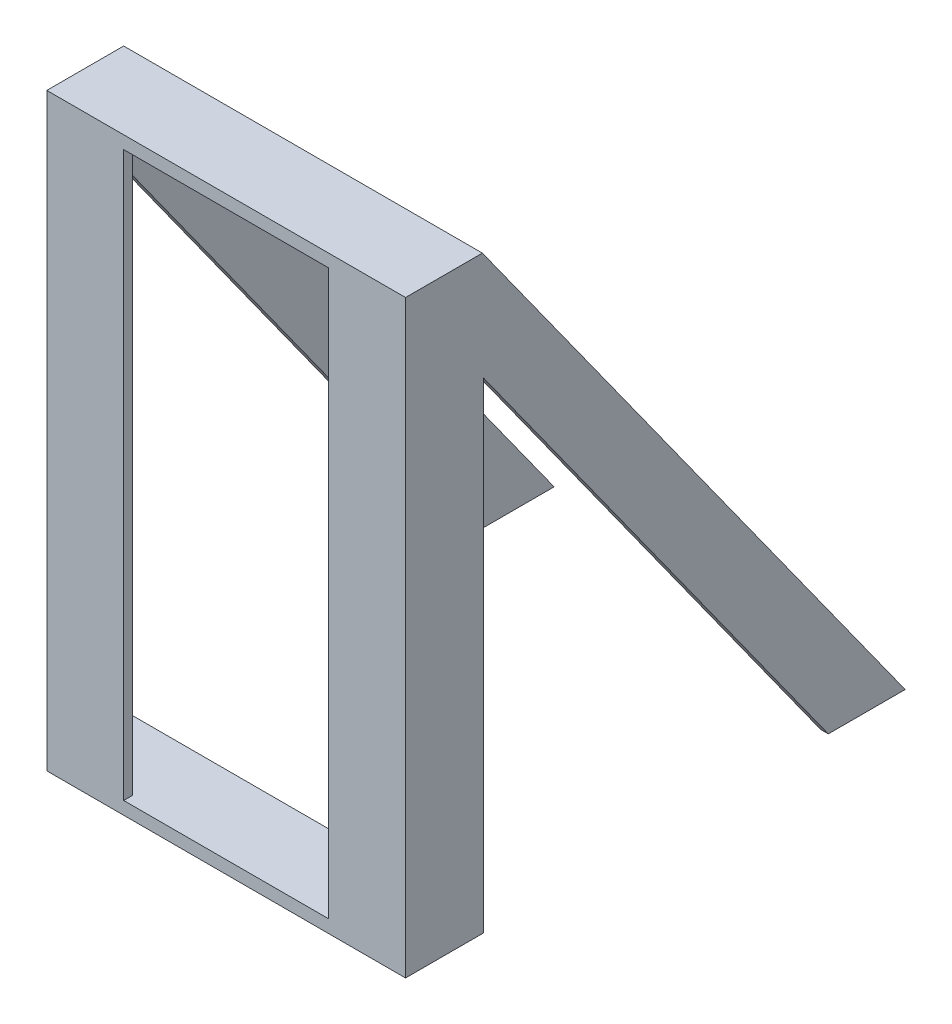
ISO-10303-21;
HEADER;
FILE_DESCRIPTION(('STEP AP214'),'2;1');
FILE_NAME('part.step','',(''),(''),'','','');
FILE_SCHEMA(('AUTOMOTIVE_DESIGN { 1 0 10303 214 1 1 1 1 }'));
ENDSEC;
DATA;
#1=APPLICATION_CONTEXT('core data for automotive mechanical design processes');
#2=APPLICATION_PROTOCOL_DEFINITION('international standard','automotive_design',2000,#1);
#3=PRODUCT_CONTEXT('',#1,'mechanical');
#4=PRODUCT('Part','Part','',(#3));
#5=PRODUCT_RELATED_PRODUCT_CATEGORY('part','',(#4));
#6=PRODUCT_DEFINITION_FORMATION('','',#4);
#7=PRODUCT_DEFINITION_CONTEXT('part definition',#1,'design');
#8=PRODUCT_DEFINITION('design','',#6,#7);
#9=PRODUCT_DEFINITION_SHAPE('','',#8);
#10=(LENGTH_UNIT() NAMED_UNIT(*) SI_UNIT(.MILLI.,.METRE.));
#11=(NAMED_UNIT(*) PLANE_ANGLE_UNIT() SI_UNIT($,.RADIAN.));
#12=(NAMED_UNIT(*) SI_UNIT($,.STERADIAN.) SOLID_ANGLE_UNIT());
#13=UNCERTAINTY_MEASURE_WITH_UNIT(LENGTH_MEASURE(1.E-05),#10,'distance_accuracy_value','');
#14=(GEOMETRIC_REPRESENTATION_CONTEXT(3) GLOBAL_UNCERTAINTY_ASSIGNED_CONTEXT((#13)) GLOBAL_UNIT_ASSIGNED_CONTEXT((#10,
#11,#12)) REPRESENTATION_CONTEXT('',''));
#15=CARTESIAN_POINT('',(0.,0.,0.));
#16=DIRECTION('',(0.,0.,1.));
#17=DIRECTION('',(1.,0.,0.));
#18=AXIS2_PLACEMENT_3D('',#15,#16,#17);
#19=CARTESIAN_POINT('',(0.,225.,0.));
#20=DIRECTION('',(0.,1.,0.));
#21=DIRECTION('',(0.,0.,1.));
#22=AXIS2_PLACEMENT_3D('',#19,#20,#21);
#23=PLANE('',#22);
#24=DIRECTION('',(-1.,0.,0.));
#25=VECTOR('',#24,1.);
#26=CARTESIAN_POINT('',(0.,225.,-30.));
#27=LINE('',#26,#25);
#28=CARTESIAN_POINT('',(137.,225.,-30.));
#29=VERTEX_POINT('',#28);
#30=CARTESIAN_POINT('',(136.6,225.,-30.));
#31=VERTEX_POINT('',#30);
#32=EDGE_CURVE('E248',#29,#31,#27,.T.);
#33=ORIENTED_EDGE('',*,*,#32,.F.);
#34=DIRECTION('',(0.,0.,1.));
#35=VECTOR('',#34,1.);
#36=CARTESIAN_POINT('',(137.,225.,0.));
#37=LINE('',#36,#35);
#38=CARTESIAN_POINT('',(137.,225.,-30.4233905934157));
#39=VERTEX_POINT('',#38);
#40=EDGE_CURVE('E401',#39,#29,#37,.T.);
#41=ORIENTED_EDGE('',*,*,#40,.F.);
#42=DIRECTION('',(-1.,0.,0.));
#43=VECTOR('',#42,1.);
#44=CARTESIAN_POINT('',(0.,225.,-30.4233905934157));
#45=LINE('',#44,#43);
#46=CARTESIAN_POINT('',(136.6,225.,-30.4233905934157));
#47=VERTEX_POINT('',#46);
#48=EDGE_CURVE('E264',#39,#47,#45,.T.);
#49=ORIENTED_EDGE('',*,*,#48,.T.);
#50=DIRECTION('',(0.,0.,1.));
#51=VECTOR('',#50,1.);
#52=CARTESIAN_POINT('',(136.6,225.,0.));
#53=LINE('',#52,#51);
#54=EDGE_CURVE('E252',#47,#31,#53,.T.);
#55=ORIENTED_EDGE('',*,*,#54,.T.);
#56=EDGE_LOOP('',(#33,#41,#49,#55));
#57=FACE_BOUND('',#56,.T.);
#58=ADVANCED_FACE('F46',(#57),#23,.T.);
#59=CARTESIAN_POINT('',(0.,225.,-30.));
#60=DIRECTION('',(0.,0.,1.));
#61=DIRECTION('',(1.,0.,0.));
#62=AXIS2_PLACEMENT_3D('',#59,#60,#61);
#63=PLANE('',#62);
#64=DIRECTION('',(0.,-1.,0.));
#65=VECTOR('',#64,1.);
#66=CARTESIAN_POINT('',(0.,225.,-30.));
#67=LINE('',#66,#65);
#68=CARTESIAN_POINT('',(0.,188.181818181818,-30.));
#69=VERTEX_POINT('',#68);
#70=CARTESIAN_POINT('',(0.,5.,-30.));
#71=VERTEX_POINT('',#70);
#72=EDGE_CURVE('E358',#69,#71,#67,.T.);
#73=ORIENTED_EDGE('',*,*,#72,.F.);
#74=DIRECTION('',(1.,0.,0.));
#75=VECTOR('',#74,1.);
#76=CARTESIAN_POINT('',(0.,188.181818181818,-30.));
#77=LINE('',#76,#75);
#78=CARTESIAN_POINT('',(2.99999999999984,188.181818181818,-30.));
#79=VERTEX_POINT('',#78);
#80=EDGE_CURVE('E225',#69,#79,#77,.T.);
#81=ORIENTED_EDGE('',*,*,#80,.T.);
#82=DIRECTION('',(0.,-1.,0.));
#83=VECTOR('',#82,1.);
#84=CARTESIAN_POINT('',(2.99999999999984,225.,-30.));
#85=LINE('',#84,#83);
#86=CARTESIAN_POINT('',(2.99999999999984,230.,-30.));
#87=VERTEX_POINT('',#86);
#88=EDGE_CURVE('E210',#87,#79,#85,.T.);
#89=ORIENTED_EDGE('',*,*,#88,.F.);
#90=DIRECTION('',(-1.,0.,0.));
#91=VECTOR('',#90,1.);
#92=CARTESIAN_POINT('',(0.,230.,-30.));
#93=LINE('',#92,#91);
#94=CARTESIAN_POINT('',(137.,230.,-30.));
#95=VERTEX_POINT('',#94);
#96=EDGE_CURVE('E223',#95,#87,#93,.T.);
#97=ORIENTED_EDGE('',*,*,#96,.F.);
#98=DIRECTION('',(0.,1.,0.));
#99=VECTOR('',#98,1.);
#100=CARTESIAN_POINT('',(137.,0.,-30.));
#101=LINE('',#100,#99);
#102=EDGE_CURVE('E404',#29,#95,#101,.T.);
#103=ORIENTED_EDGE('',*,*,#102,.F.);
#104=ORIENTED_EDGE('',*,*,#32,.T.);
#105=CARTESIAN_POINT('',(3.4,225.,-30.));
#106=VERTEX_POINT('',#105);
#107=EDGE_CURVE('E246',#31,#106,#27,.T.);
#108=ORIENTED_EDGE('',*,*,#107,.T.);
#109=DIRECTION('',(0.,-1.,0.));
#110=VECTOR('',#109,1.);
#111=CARTESIAN_POINT('',(3.4,225.,-30.));
#112=LINE('',#111,#110);
#113=CARTESIAN_POINT('',(3.4,5.,-30.));
#114=VERTEX_POINT('',#113);
#115=EDGE_CURVE('E361',#106,#114,#112,.T.);
#116=ORIENTED_EDGE('',*,*,#115,.T.);
#117=DIRECTION('',(1.,0.,0.));
#118=VECTOR('',#117,1.);
#119=CARTESIAN_POINT('',(0.,5.,-30.));
#120=LINE('',#119,#118);
#121=EDGE_CURVE('E307',#71,#114,#120,.T.);
#122=ORIENTED_EDGE('',*,*,#121,.F.);
#123=EDGE_LOOP('',(#73,#81,#89,#97,#103,#104,#108,#116,#122));
#124=FACE_BOUND('',#123,.T.);
#125=ADVANCED_FACE('F221',(#124),#63,.F.);
#126=CARTESIAN_POINT('',(0.,5.,-30.4233905934157));
#127=DIRECTION('',(0.,0.,-1.));
#128=DIRECTION('',(-1.,0.,0.));
#129=AXIS2_PLACEMENT_3D('',#126,#127,#128);
#130=PLANE('',#129);
#131=DIRECTION('',(0.,1.,0.));
#132=VECTOR('',#131,1.);
#133=CARTESIAN_POINT('',(137.,0.,-30.4233905934157));
#134=LINE('',#133,#132);
#135=CARTESIAN_POINT('',(137.,187.591637354633,-30.4233905934157));
#136=VERTEX_POINT('',#135);
#137=EDGE_CURVE('E398',#136,#39,#134,.T.);
#138=ORIENTED_EDGE('',*,*,#137,.F.);
#139=DIRECTION('',(1.,0.,0.));
#140=VECTOR('',#139,1.);
#141=CARTESIAN_POINT('',(137.,187.591637354633,-30.4233905934157));
#142=LINE('',#141,#140);
#143=CARTESIAN_POINT('',(140.,187.591637354633,-30.4233905934157));
#144=VERTEX_POINT('',#143);
#145=EDGE_CURVE('E247',#136,#144,#142,.T.);
#146=ORIENTED_EDGE('',*,*,#145,.T.);
#147=DIRECTION('',(0.,-1.,0.));
#148=VECTOR('',#147,1.);
#149=CARTESIAN_POINT('',(140.,5.,-30.4233905934157));
#150=LINE('',#149,#148);
#151=CARTESIAN_POINT('',(140.,0.,-30.4233905934157));
#152=VERTEX_POINT('',#151);
#153=EDGE_CURVE('E326',#144,#152,#150,.T.);
#154=ORIENTED_EDGE('',*,*,#153,.T.);
#155=DIRECTION('',(1.,0.,0.));
#156=VECTOR('',#155,1.);
#157=CARTESIAN_POINT('',(0.,0.,-30.4233905934157));
#158=LINE('',#157,#156);
#159=CARTESIAN_POINT('',(0.,0.,-30.4233905934157));
#160=VERTEX_POINT('',#159);
#161=EDGE_CURVE('E296',#160,#152,#158,.T.);
#162=ORIENTED_EDGE('',*,*,#161,.F.);
#163=DIRECTION('',(0.,-1.,0.));
#164=VECTOR('',#163,1.);
#165=CARTESIAN_POINT('',(0.,5.,-30.4233905934157));
#166=LINE('',#165,#164);
#167=CARTESIAN_POINT('',(0.,5.,-30.4233905934157));
#168=VERTEX_POINT('',#167);
#169=EDGE_CURVE('E330',#168,#160,#166,.T.);
#170=ORIENTED_EDGE('',*,*,#169,.F.);
#171=DIRECTION('',(1.,0.,0.));
#172=VECTOR('',#171,1.);
#173=CARTESIAN_POINT('',(0.,5.,-30.4233905934157));
#174=LINE('',#173,#172);
#175=CARTESIAN_POINT('',(136.6,5.,-30.4233905934157));
#176=VERTEX_POINT('',#175);
#177=EDGE_CURVE('E315',#168,#176,#174,.T.);
#178=ORIENTED_EDGE('',*,*,#177,.T.);
#179=DIRECTION('',(0.,-1.,0.));
#180=VECTOR('',#179,1.);
#181=CARTESIAN_POINT('',(136.6,225.,-30.4233905934157));
#182=LINE('',#181,#180);
#183=EDGE_CURVE('E267',#47,#176,#182,.T.);
#184=ORIENTED_EDGE('',*,*,#183,.F.);
#185=ORIENTED_EDGE('',*,*,#48,.F.);
#186=EDGE_LOOP('',(#138,#146,#154,#162,#170,#178,#184,#185));
#187=FACE_BOUND('',#186,.T.);
#188=ADVANCED_FACE('F492',(#187),#130,.T.);
#189=CARTESIAN_POINT('',(0.,5.,0.));
#190=DIRECTION('',(0.,-1.,0.));
#191=DIRECTION('',(0.,0.,-1.));
#192=AXIS2_PLACEMENT_3D('',#189,#190,#191);
#193=PLANE('',#192);
#194=DIRECTION('',(0.,0.,1.));
#195=VECTOR('',#194,1.);
#196=CARTESIAN_POINT('',(136.6,5.,0.));
#197=LINE('',#196,#195);
#198=CARTESIAN_POINT('',(136.6,5.,-3.4));
#199=VERTEX_POINT('',#198);
#200=EDGE_CURVE('E237',#176,#199,#197,.T.);
#201=ORIENTED_EDGE('',*,*,#200,.F.);
#202=ORIENTED_EDGE('',*,*,#177,.F.);
#203=DIRECTION('',(0.,0.,-1.));
#204=VECTOR('',#203,1.);
#205=CARTESIAN_POINT('',(0.,5.,0.));
#206=LINE('',#205,#204);
#207=EDGE_CURVE('E311',#71,#168,#206,.T.);
#208=ORIENTED_EDGE('',*,*,#207,.F.);
#209=ORIENTED_EDGE('',*,*,#121,.T.);
#210=DIRECTION('',(0.,0.,1.));
#211=VECTOR('',#210,1.);
#212=CARTESIAN_POINT('',(3.4,5.,0.));
#213=LINE('',#212,#211);
#214=CARTESIAN_POINT('',(3.4,5.,-3.4));
#215=VERTEX_POINT('',#214);
#216=EDGE_CURVE('E303',#114,#215,#213,.T.);
#217=ORIENTED_EDGE('',*,*,#216,.T.);
#218=DIRECTION('',(1.,0.,0.));
#219=VECTOR('',#218,1.);
#220=CARTESIAN_POINT('',(0.,5.,-3.4));
#221=LINE('',#220,#219);
#222=CARTESIAN_POINT('',(30.,5.,-3.4));
#223=VERTEX_POINT('',#222);
#224=EDGE_CURVE('E299',#215,#223,#221,.T.);
#225=ORIENTED_EDGE('',*,*,#224,.T.);
#226=DIRECTION('',(0.,0.,1.));
#227=VECTOR('',#226,1.);
#228=CARTESIAN_POINT('',(30.,5.,0.));
#229=LINE('',#228,#227);
#230=CARTESIAN_POINT('',(30.,5.,0.));
#231=VERTEX_POINT('',#230);
#232=EDGE_CURVE('E295',#223,#231,#229,.T.);
#233=ORIENTED_EDGE('',*,*,#232,.T.);
#234=DIRECTION('',(1.,0.,0.));
#235=VECTOR('',#234,1.);
#236=CARTESIAN_POINT('',(0.,5.,0.));
#237=LINE('',#236,#235);
#238=CARTESIAN_POINT('',(110.,5.,0.));
#239=VERTEX_POINT('',#238);
#240=EDGE_CURVE('E291',#231,#239,#237,.T.);
#241=ORIENTED_EDGE('',*,*,#240,.T.);
#242=DIRECTION('',(0.,0.,-1.));
#243=VECTOR('',#242,1.);
#244=CARTESIAN_POINT('',(110.,5.,0.));
#245=LINE('',#244,#243);
#246=CARTESIAN_POINT('',(110.,5.,-3.4));
#247=VERTEX_POINT('',#246);
#248=EDGE_CURVE('E275',#239,#247,#245,.T.);
#249=ORIENTED_EDGE('',*,*,#248,.T.);
#250=DIRECTION('',(-1.,0.,0.));
#251=VECTOR('',#250,1.);
#252=CARTESIAN_POINT('',(0.,5.,-3.4));
#253=LINE('',#252,#251);
#254=EDGE_CURVE('E271',#199,#247,#253,.T.);
#255=ORIENTED_EDGE('',*,*,#254,.F.);
#256=EDGE_LOOP('',(#201,#202,#208,#209,#217,#225,#233,#241,#249,#255));
#257=FACE_BOUND('',#256,.T.);
#258=ADVANCED_FACE('F375',(#257),#193,.F.);
#259=CARTESIAN_POINT('',(30.,225.,0.));
#260=DIRECTION('',(-1.,0.,0.));
#261=DIRECTION('',(0.,0.,1.));
#262=AXIS2_PLACEMENT_3D('',#259,#260,#261);
#263=PLANE('',#262);
#264=ORIENTED_EDGE('',*,*,#232,.F.);
#265=DIRECTION('',(0.,-1.,0.));
#266=VECTOR('',#265,1.);
#267=CARTESIAN_POINT('',(30.,225.,-3.4));
#268=LINE('',#267,#266);
#269=CARTESIAN_POINT('',(30.,225.,-3.4));
#270=VERTEX_POINT('',#269);
#271=EDGE_CURVE('E55',#270,#223,#268,.T.);
#272=ORIENTED_EDGE('',*,*,#271,.F.);
#273=DIRECTION('',(0.,0.,-1.));
#274=VECTOR('',#273,1.);
#275=CARTESIAN_POINT('',(30.,225.,0.));
#276=LINE('',#275,#274);
#277=CARTESIAN_POINT('',(30.,225.,0.));
#278=VERTEX_POINT('',#277);
#279=EDGE_CURVE('E337',#278,#270,#276,.T.);
#280=ORIENTED_EDGE('',*,*,#279,.F.);
#281=DIRECTION('',(0.,-1.,0.));
#282=VECTOR('',#281,1.);
#283=CARTESIAN_POINT('',(30.,225.,0.));
#284=LINE('',#283,#282);
#285=EDGE_CURVE('E11',#278,#231,#284,.T.);
#286=ORIENTED_EDGE('',*,*,#285,.T.);
#287=EDGE_LOOP('',(#264,#272,#280,#286));
#288=FACE_BOUND('',#287,.T.);
#289=ADVANCED_FACE('F527',(#288),#263,.F.);
#290=CARTESIAN_POINT('',(3.4,225.,-3.4));
#291=DIRECTION('',(0.,0.,1.));
#292=DIRECTION('',(1.,0.,0.));
#293=AXIS2_PLACEMENT_3D('',#290,#291,#292);
#294=PLANE('',#293);
#295=ORIENTED_EDGE('',*,*,#224,.F.);
#296=DIRECTION('',(0.,-1.,0.));
#297=VECTOR('',#296,1.);
#298=CARTESIAN_POINT('',(3.4,225.,-3.4));
#299=LINE('',#298,#297);
#300=CARTESIAN_POINT('',(3.4,225.,-3.4));
#301=VERTEX_POINT('',#300);
#302=EDGE_CURVE('E365',#301,#215,#299,.T.);
#303=ORIENTED_EDGE('',*,*,#302,.F.);
#304=DIRECTION('',(-1.,0.,0.));
#305=VECTOR('',#304,1.);
#306=CARTESIAN_POINT('',(3.4,225.,-3.4));
#307=LINE('',#306,#305);
#308=EDGE_CURVE('E341',#270,#301,#307,.T.);
#309=ORIENTED_EDGE('',*,*,#308,.F.);
#310=ORIENTED_EDGE('',*,*,#271,.T.);
#311=EDGE_LOOP('',(#295,#303,#309,#310));
#312=FACE_BOUND('',#311,.T.);
#313=ADVANCED_FACE('F372',(#312),#294,.F.);
#314=CARTESIAN_POINT('',(3.4,225.,-30.));
#315=DIRECTION('',(-1.,0.,0.));
#316=DIRECTION('',(0.,0.,1.));
#317=AXIS2_PLACEMENT_3D('',#314,#315,#316);
#318=PLANE('',#317);
#319=ORIENTED_EDGE('',*,*,#216,.F.);
#320=ORIENTED_EDGE('',*,*,#115,.F.);
#321=DIRECTION('',(0.,0.,-1.));
#322=VECTOR('',#321,1.);
#323=CARTESIAN_POINT('',(3.4,225.,-30.));
#324=LINE('',#323,#322);
#325=EDGE_CURVE('E346',#301,#106,#324,.T.);
#326=ORIENTED_EDGE('',*,*,#325,.F.);
#327=ORIENTED_EDGE('',*,*,#302,.T.);
#328=EDGE_LOOP('',(#319,#320,#326,#327));
#329=FACE_BOUND('',#328,.T.);
#330=ADVANCED_FACE('F380',(#329),#318,.F.);
#331=CARTESIAN_POINT('',(0.,225.,0.));
#332=DIRECTION('',(0.,0.,-1.));
#333=DIRECTION('',(-1.,0.,0.));
#334=AXIS2_PLACEMENT_3D('',#331,#332,#333);
#335=PLANE('',#334);
#336=ORIENTED_EDGE('',*,*,#285,.F.);
#337=DIRECTION('',(1.,0.,0.));
#338=VECTOR('',#337,1.);
#339=CARTESIAN_POINT('',(0.,225.,0.));
#340=LINE('',#339,#338);
#341=CARTESIAN_POINT('',(110.,225.,0.));
#342=VERTEX_POINT('',#341);
#343=EDGE_CURVE('E242',#278,#342,#340,.T.);
#344=ORIENTED_EDGE('',*,*,#343,.T.);
#345=DIRECTION('',(0.,-1.,0.));
#346=VECTOR('',#345,1.);
#347=CARTESIAN_POINT('',(110.,225.,0.));
#348=LINE('',#347,#346);
#349=EDGE_CURVE('E281',#342,#239,#348,.T.);
#350=ORIENTED_EDGE('',*,*,#349,.T.);
#351=ORIENTED_EDGE('',*,*,#240,.F.);
#352=EDGE_LOOP('',(#336,#344,#350,#351));
#353=FACE_BOUND('',#352,.T.);
#354=DIRECTION('',(1.,0.,0.));
#355=VECTOR('',#354,1.);
#356=CARTESIAN_POINT('',(0.,0.,0.));
#357=LINE('',#356,#355);
#358=CARTESIAN_POINT('',(0.,0.,0.));
#359=VERTEX_POINT('',#358);
#360=CARTESIAN_POINT('',(140.,0.,0.));
#361=VERTEX_POINT('',#360);
#362=EDGE_CURVE('E329',#359,#361,#357,.T.);
#363=ORIENTED_EDGE('',*,*,#362,.T.);
#364=DIRECTION('',(0.,-1.,0.));
#365=VECTOR('',#364,1.);
#366=CARTESIAN_POINT('',(140.,5.,0.));
#367=LINE('',#366,#365);
#368=CARTESIAN_POINT('',(140.,230.,0.));
#369=VERTEX_POINT('',#368);
#370=EDGE_CURVE('E319',#369,#361,#367,.T.);
#371=ORIENTED_EDGE('',*,*,#370,.F.);
#372=DIRECTION('',(1.,0.,0.));
#373=VECTOR('',#372,1.);
#374=CARTESIAN_POINT('',(0.,230.,0.));
#375=LINE('',#374,#373);
#376=CARTESIAN_POINT('',(0.,230.,0.));
#377=VERTEX_POINT('',#376);
#378=EDGE_CURVE('E238',#377,#369,#375,.T.);
#379=ORIENTED_EDGE('',*,*,#378,.F.);
#380=DIRECTION('',(0.,-1.,0.));
#381=VECTOR('',#380,1.);
#382=CARTESIAN_POINT('',(0.,225.,0.));
#383=LINE('',#382,#381);
#384=EDGE_CURVE('E350',#377,#359,#383,.T.);
#385=ORIENTED_EDGE('',*,*,#384,.T.);
#386=EDGE_LOOP('',(#363,#371,#379,#385));
#387=FACE_BOUND('',#386,.T.);
#388=ADVANCED_FACE('F48',(#353,#387),#335,.F.);
#389=CARTESIAN_POINT('',(0.,225.,0.));
#390=DIRECTION('',(1.,0.,0.));
#391=DIRECTION('',(0.,0.,-1.));
#392=AXIS2_PLACEMENT_3D('',#389,#390,#391);
#393=PLANE('',#392);
#394=ORIENTED_EDGE('',*,*,#384,.F.);
#395=DIRECTION('',(0.,0.,1.));
#396=VECTOR('',#395,1.);
#397=CARTESIAN_POINT('',(0.,230.,-30.));
#398=LINE('',#397,#396);
#399=CARTESIAN_POINT('',(0.,230.,-30.));
#400=VERTEX_POINT('',#399);
#401=EDGE_CURVE('E251',#400,#377,#398,.T.);
#402=ORIENTED_EDGE('',*,*,#401,.F.);
#403=DIRECTION('',(0.,-0.812538250629685,-0.582907875451731));
#404=VECTOR('',#403,1.);
#405=CARTESIAN_POINT('',(0.,230.,-30.));
#406=LINE('',#405,#404);
#407=CARTESIAN_POINT('',(0.,0.,-195.));
#408=VERTEX_POINT('',#407);
#409=EDGE_CURVE('E196',#400,#408,#406,.T.);
#410=ORIENTED_EDGE('',*,*,#409,.T.);
#411=DIRECTION('',(0.,0.,1.));
#412=VECTOR('',#411,1.);
#413=CARTESIAN_POINT('',(0.,0.,-195.));
#414=LINE('',#413,#412);
#415=CARTESIAN_POINT('',(0.,0.,-165.));
#416=VERTEX_POINT('',#415);
#417=EDGE_CURVE('E440',#408,#416,#414,.T.);
#418=ORIENTED_EDGE('',*,*,#417,.T.);
#419=DIRECTION('',(0.,0.812538250629685,0.582907875451731));
#420=VECTOR('',#419,1.);
#421=CARTESIAN_POINT('',(0.,0.,-165.));
#422=LINE('',#421,#420);
#423=EDGE_CURVE('E215',#416,#69,#422,.T.);
#424=ORIENTED_EDGE('',*,*,#423,.T.);
#425=ORIENTED_EDGE('',*,*,#72,.T.);
#426=ORIENTED_EDGE('',*,*,#207,.T.);
#427=ORIENTED_EDGE('',*,*,#169,.T.);
#428=DIRECTION('',(0.,0.,1.));
#429=VECTOR('',#428,1.);
#430=CARTESIAN_POINT('',(0.,0.,0.));
#431=LINE('',#430,#429);
#432=EDGE_CURVE('E342',#160,#359,#431,.T.);
#433=ORIENTED_EDGE('',*,*,#432,.T.);
#434=EDGE_LOOP('',(#394,#402,#410,#418,#424,#425,#426,#427,#433));
#435=FACE_BOUND('',#434,.T.);
#436=ADVANCED_FACE('F494',(#435),#393,.F.);
#437=CARTESIAN_POINT('',(0.,0.,0.));
#438=DIRECTION('',(0.,1.,0.));
#439=DIRECTION('',(0.,0.,1.));
#440=AXIS2_PLACEMENT_3D('',#437,#438,#439);
#441=PLANE('',#440);
#442=ORIENTED_EDGE('',*,*,#432,.F.);
#443=ORIENTED_EDGE('',*,*,#161,.T.);
#444=DIRECTION('',(0.,0.,-1.));
#445=VECTOR('',#444,1.);
#446=CARTESIAN_POINT('',(140.,0.,0.));
#447=LINE('',#446,#445);
#448=EDGE_CURVE('E290',#361,#152,#447,.T.);
#449=ORIENTED_EDGE('',*,*,#448,.F.);
#450=ORIENTED_EDGE('',*,*,#362,.F.);
#451=EDGE_LOOP('',(#442,#443,#449,#450));
#452=FACE_BOUND('',#451,.T.);
#453=ADVANCED_FACE('F532',(#452),#441,.F.);
#454=CARTESIAN_POINT('',(140.,5.,0.));
#455=DIRECTION('',(-1.,0.,0.));
#456=DIRECTION('',(0.,0.,1.));
#457=AXIS2_PLACEMENT_3D('',#454,#455,#456);
#458=PLANE('',#457);
#459=ORIENTED_EDGE('',*,*,#448,.T.);
#460=ORIENTED_EDGE('',*,*,#153,.F.);
#461=DIRECTION('',(0.,0.812538250629685,0.582907875451731));
#462=VECTOR('',#461,1.);
#463=CARTESIAN_POINT('',(140.,78.1497659906397,-108.936037441498));
#464=LINE('',#463,#462);
#465=CARTESIAN_POINT('',(140.,0.,-165.));
#466=VERTEX_POINT('',#465);
#467=EDGE_CURVE('E424',#466,#144,#464,.T.);
#468=ORIENTED_EDGE('',*,*,#467,.F.);
#469=DIRECTION('',(0.,0.,-1.));
#470=VECTOR('',#469,1.);
#471=CARTESIAN_POINT('',(140.,0.,0.));
#472=LINE('',#471,#470);
#473=CARTESIAN_POINT('',(140.,0.,-195.));
#474=VERTEX_POINT('',#473);
#475=EDGE_CURVE('E420',#466,#474,#472,.T.);
#476=ORIENTED_EDGE('',*,*,#475,.T.);
#477=DIRECTION('',(0.,-0.812538250629685,-0.582907875451731));
#478=VECTOR('',#477,1.);
#479=CARTESIAN_POINT('',(140.,92.3588143525741,-128.742589703588));
#480=LINE('',#479,#478);
#481=CARTESIAN_POINT('',(140.,230.,-30.));
#482=VERTEX_POINT('',#481);
#483=EDGE_CURVE('E416',#482,#474,#480,.T.);
#484=ORIENTED_EDGE('',*,*,#483,.F.);
#485=DIRECTION('',(0.,0.,-1.));
#486=VECTOR('',#485,1.);
#487=CARTESIAN_POINT('',(140.,230.,-30.));
#488=LINE('',#487,#486);
#489=EDGE_CURVE('E233',#369,#482,#488,.T.);
#490=ORIENTED_EDGE('',*,*,#489,.F.);
#491=ORIENTED_EDGE('',*,*,#370,.T.);
#492=EDGE_LOOP('',(#459,#460,#468,#476,#484,#490,#491));
#493=FACE_BOUND('',#492,.T.);
#494=ADVANCED_FACE('F457',(#493),#458,.F.);
#495=CARTESIAN_POINT('',(136.6,225.,0.));
#496=DIRECTION('',(1.,0.,0.));
#497=DIRECTION('',(0.,0.,-1.));
#498=AXIS2_PLACEMENT_3D('',#495,#496,#497);
#499=PLANE('',#498);
#500=ORIENTED_EDGE('',*,*,#200,.T.);
#501=DIRECTION('',(0.,-1.,0.));
#502=VECTOR('',#501,1.);
#503=CARTESIAN_POINT('',(136.6,225.,-3.4));
#504=LINE('',#503,#502);
#505=CARTESIAN_POINT('',(136.6,225.,-3.4));
#506=VERTEX_POINT('',#505);
#507=EDGE_CURVE('E287',#506,#199,#504,.T.);
#508=ORIENTED_EDGE('',*,*,#507,.F.);
#509=EDGE_CURVE('E257',#31,#506,#53,.T.);
#510=ORIENTED_EDGE('',*,*,#509,.F.);
#511=ORIENTED_EDGE('',*,*,#54,.F.);
#512=ORIENTED_EDGE('',*,*,#183,.T.);
#513=EDGE_LOOP('',(#500,#508,#510,#511,#512));
#514=FACE_BOUND('',#513,.T.);
#515=ADVANCED_FACE('F474',(#514),#499,.F.);
#516=CARTESIAN_POINT('',(0.,225.,-3.4));
#517=DIRECTION('',(0.,0.,1.));
#518=DIRECTION('',(1.,0.,0.));
#519=AXIS2_PLACEMENT_3D('',#516,#517,#518);
#520=PLANE('',#519);
#521=ORIENTED_EDGE('',*,*,#254,.T.);
#522=DIRECTION('',(0.,-1.,0.));
#523=VECTOR('',#522,1.);
#524=CARTESIAN_POINT('',(110.,225.,-3.4));
#525=LINE('',#524,#523);
#526=CARTESIAN_POINT('',(110.,225.,-3.4));
#527=VERTEX_POINT('',#526);
#528=EDGE_CURVE('E284',#527,#247,#525,.T.);
#529=ORIENTED_EDGE('',*,*,#528,.F.);
#530=DIRECTION('',(-1.,0.,0.));
#531=VECTOR('',#530,1.);
#532=CARTESIAN_POINT('',(0.,225.,-3.4));
#533=LINE('',#532,#531);
#534=EDGE_CURVE('E256',#506,#527,#533,.T.);
#535=ORIENTED_EDGE('',*,*,#534,.F.);
#536=ORIENTED_EDGE('',*,*,#507,.T.);
#537=EDGE_LOOP('',(#521,#529,#535,#536));
#538=FACE_BOUND('',#537,.T.);
#539=ADVANCED_FACE('F482',(#538),#520,.F.);
#540=CARTESIAN_POINT('',(110.,225.,0.));
#541=DIRECTION('',(-1.,0.,0.));
#542=DIRECTION('',(0.,0.,1.));
#543=AXIS2_PLACEMENT_3D('',#540,#541,#542);
#544=PLANE('',#543);
#545=ORIENTED_EDGE('',*,*,#248,.F.);
#546=ORIENTED_EDGE('',*,*,#349,.F.);
#547=DIRECTION('',(0.,0.,-1.));
#548=VECTOR('',#547,1.);
#549=CARTESIAN_POINT('',(110.,225.,0.));
#550=LINE('',#549,#548);
#551=EDGE_CURVE('E260',#342,#527,#550,.T.);
#552=ORIENTED_EDGE('',*,*,#551,.T.);
#553=ORIENTED_EDGE('',*,*,#528,.T.);
#554=EDGE_LOOP('',(#545,#546,#552,#553));
#555=FACE_BOUND('',#554,.T.);
#556=ADVANCED_FACE('F487',(#555),#544,.T.);
#557=CARTESIAN_POINT('',(0.,225.,0.));
#558=DIRECTION('',(0.,1.,0.));
#559=DIRECTION('',(0.,0.,1.));
#560=AXIS2_PLACEMENT_3D('',#557,#558,#559);
#561=PLANE('',#560);
#562=ORIENTED_EDGE('',*,*,#343,.F.);
#563=ORIENTED_EDGE('',*,*,#279,.T.);
#564=ORIENTED_EDGE('',*,*,#308,.T.);
#565=ORIENTED_EDGE('',*,*,#325,.T.);
#566=ORIENTED_EDGE('',*,*,#107,.F.);
#567=ORIENTED_EDGE('',*,*,#509,.T.);
#568=ORIENTED_EDGE('',*,*,#534,.T.);
#569=ORIENTED_EDGE('',*,*,#551,.F.);
#570=EDGE_LOOP('',(#562,#563,#564,#565,#566,#567,#568,#569));
#571=FACE_BOUND('',#570,.T.);
#572=ADVANCED_FACE('F479',(#571),#561,.F.);
#573=CARTESIAN_POINT('',(0.,230.,0.));
#574=DIRECTION('',(0.,1.,0.));
#575=DIRECTION('',(0.,0.,1.));
#576=AXIS2_PLACEMENT_3D('',#573,#574,#575);
#577=PLANE('',#576);
#578=ORIENTED_EDGE('',*,*,#378,.T.);
#579=ORIENTED_EDGE('',*,*,#489,.T.);
#580=EDGE_CURVE('E231',#482,#95,#93,.T.);
#581=ORIENTED_EDGE('',*,*,#580,.T.);
#582=ORIENTED_EDGE('',*,*,#96,.T.);
#583=DIRECTION('',(-1.,0.,0.));
#584=VECTOR('',#583,1.);
#585=CARTESIAN_POINT('',(2.99999999999984,230.,-30.));
#586=LINE('',#585,#584);
#587=EDGE_CURVE('E191',#87,#400,#586,.T.);
#588=ORIENTED_EDGE('',*,*,#587,.T.);
#589=ORIENTED_EDGE('',*,*,#401,.T.);
#590=EDGE_LOOP('',(#578,#579,#581,#582,#588,#589));
#591=FACE_BOUND('',#590,.T.);
#592=ADVANCED_FACE('F229',(#591),#577,.T.);
#593=CARTESIAN_POINT('',(137.,78.1497659906397,-108.936037441498));
#594=DIRECTION('',(0.,0.582907875451731,-0.812538250629685));
#595=DIRECTION('',(0.,0.812538250629685,0.582907875451731));
#596=AXIS2_PLACEMENT_3D('',#593,#594,#595);
#597=PLANE('',#596);
#598=ORIENTED_EDGE('',*,*,#467,.T.);
#599=ORIENTED_EDGE('',*,*,#145,.F.);
#600=DIRECTION('',(0.,0.812538250629685,0.582907875451731));
#601=VECTOR('',#600,1.);
#602=CARTESIAN_POINT('',(137.,78.1497659906397,-108.936037441498));
#603=LINE('',#602,#601);
#604=CARTESIAN_POINT('',(137.,0.,-165.));
#605=VERTEX_POINT('',#604);
#606=EDGE_CURVE('E413',#605,#136,#603,.T.);
#607=ORIENTED_EDGE('',*,*,#606,.F.);
#608=DIRECTION('',(1.,0.,0.));
#609=VECTOR('',#608,1.);
#610=CARTESIAN_POINT('',(137.,0.,-165.));
#611=LINE('',#610,#609);
#612=EDGE_CURVE('E395',#605,#466,#611,.T.);
#613=ORIENTED_EDGE('',*,*,#612,.T.);
#614=EDGE_LOOP('',(#598,#599,#607,#613));
#615=FACE_BOUND('',#614,.T.);
#616=ADVANCED_FACE('F597',(#615),#597,.F.);
#617=CARTESIAN_POINT('',(137.,92.3588143525741,-128.742589703588));
#618=DIRECTION('',(0.,-0.582907875451731,0.812538250629685));
#619=DIRECTION('',(0.,-0.812538250629685,-0.582907875451731));
#620=AXIS2_PLACEMENT_3D('',#617,#618,#619);
#621=PLANE('',#620);
#622=ORIENTED_EDGE('',*,*,#483,.T.);
#623=DIRECTION('',(1.,0.,0.));
#624=VECTOR('',#623,1.);
#625=CARTESIAN_POINT('',(137.,0.,-195.));
#626=LINE('',#625,#624);
#627=CARTESIAN_POINT('',(137.,0.,-195.));
#628=VERTEX_POINT('',#627);
#629=EDGE_CURVE('E392',#628,#474,#626,.T.);
#630=ORIENTED_EDGE('',*,*,#629,.F.);
#631=DIRECTION('',(0.,-0.812538250629685,-0.582907875451731));
#632=VECTOR('',#631,1.);
#633=CARTESIAN_POINT('',(137.,92.3588143525741,-128.742589703588));
#634=LINE('',#633,#632);
#635=EDGE_CURVE('E62',#95,#628,#634,.T.);
#636=ORIENTED_EDGE('',*,*,#635,.F.);
#637=ORIENTED_EDGE('',*,*,#580,.F.);
#638=EDGE_LOOP('',(#622,#630,#636,#637));
#639=FACE_BOUND('',#638,.T.);
#640=ADVANCED_FACE('F460',(#639),#621,.F.);
#641=CARTESIAN_POINT('',(137.,0.,0.));
#642=DIRECTION('',(0.,-1.,0.));
#643=DIRECTION('',(0.,0.,-1.));
#644=AXIS2_PLACEMENT_3D('',#641,#642,#643);
#645=PLANE('',#644);
#646=ORIENTED_EDGE('',*,*,#475,.F.);
#647=ORIENTED_EDGE('',*,*,#612,.F.);
#648=DIRECTION('',(0.,0.,-1.));
#649=VECTOR('',#648,1.);
#650=CARTESIAN_POINT('',(137.,0.,0.));
#651=LINE('',#650,#649);
#652=EDGE_CURVE('E409',#605,#628,#651,.T.);
#653=ORIENTED_EDGE('',*,*,#652,.T.);
#654=ORIENTED_EDGE('',*,*,#629,.T.);
#655=EDGE_LOOP('',(#646,#647,#653,#654));
#656=FACE_BOUND('',#655,.T.);
#657=ADVANCED_FACE('F463',(#656),#645,.T.);
#658=CARTESIAN_POINT('',(137.,0.,0.));
#659=DIRECTION('',(1.,0.,0.));
#660=DIRECTION('',(0.,0.,-1.));
#661=AXIS2_PLACEMENT_3D('',#658,#659,#660);
#662=PLANE('',#661);
#663=ORIENTED_EDGE('',*,*,#606,.T.);
#664=ORIENTED_EDGE('',*,*,#137,.T.);
#665=ORIENTED_EDGE('',*,*,#40,.T.);
#666=ORIENTED_EDGE('',*,*,#102,.T.);
#667=ORIENTED_EDGE('',*,*,#635,.T.);
#668=ORIENTED_EDGE('',*,*,#652,.F.);
#669=EDGE_LOOP('',(#663,#664,#665,#666,#667,#668));
#670=FACE_BOUND('',#669,.T.);
#671=ADVANCED_FACE('F466',(#670),#662,.F.);
#672=CARTESIAN_POINT('',(2.99999999999984,0.,-165.));
#673=DIRECTION('',(0.,-0.582907875451731,0.812538250629685));
#674=DIRECTION('',(0.,-0.812538250629685,-0.582907875451731));
#675=AXIS2_PLACEMENT_3D('',#672,#673,#674);
#676=PLANE('',#675);
#677=ORIENTED_EDGE('',*,*,#80,.F.);
#678=ORIENTED_EDGE('',*,*,#423,.F.);
#679=DIRECTION('',(-1.,0.,0.));
#680=VECTOR('',#679,1.);
#681=CARTESIAN_POINT('',(2.99999999999984,0.,-165.));
#682=LINE('',#681,#680);
#683=CARTESIAN_POINT('',(2.99999999999984,0.,-165.));
#684=VERTEX_POINT('',#683);
#685=EDGE_CURVE('E227',#684,#416,#682,.T.);
#686=ORIENTED_EDGE('',*,*,#685,.F.);
#687=DIRECTION('',(0.,0.812538250629685,0.582907875451731));
#688=VECTOR('',#687,1.);
#689=CARTESIAN_POINT('',(2.99999999999984,0.,-165.));
#690=LINE('',#689,#688);
#691=EDGE_CURVE('E203',#684,#79,#690,.T.);
#692=ORIENTED_EDGE('',*,*,#691,.T.);
#693=EDGE_LOOP('',(#677,#678,#686,#692));
#694=FACE_BOUND('',#693,.T.);
#695=ADVANCED_FACE('F498',(#694),#676,.T.);
#696=CARTESIAN_POINT('',(2.99999999999984,0.,0.));
#697=DIRECTION('',(-1.,0.,0.));
#698=DIRECTION('',(0.,0.,1.));
#699=AXIS2_PLACEMENT_3D('',#696,#697,#698);
#700=PLANE('',#699);
#701=DIRECTION('',(0.,-0.812538250629685,-0.582907875451731));
#702=VECTOR('',#701,1.);
#703=CARTESIAN_POINT('',(2.99999999999984,230.,-30.));
#704=LINE('',#703,#702);
#705=CARTESIAN_POINT('',(2.99999999999984,0.,-195.));
#706=VERTEX_POINT('',#705);
#707=EDGE_CURVE('E194',#87,#706,#704,.T.);
#708=ORIENTED_EDGE('',*,*,#707,.F.);
#709=ORIENTED_EDGE('',*,*,#88,.T.);
#710=ORIENTED_EDGE('',*,*,#691,.F.);
#711=DIRECTION('',(0.,0.,1.));
#712=VECTOR('',#711,1.);
#713=CARTESIAN_POINT('',(2.99999999999984,0.,-195.));
#714=LINE('',#713,#712);
#715=EDGE_CURVE('E213',#706,#684,#714,.T.);
#716=ORIENTED_EDGE('',*,*,#715,.F.);
#717=EDGE_LOOP('',(#708,#709,#710,#716));
#718=FACE_BOUND('',#717,.T.);
#719=ADVANCED_FACE('F208',(#718),#700,.F.);
#720=CARTESIAN_POINT('',(2.99999999999984,0.,-195.));
#721=DIRECTION('',(0.,-1.,0.));
#722=DIRECTION('',(0.,0.,-1.));
#723=AXIS2_PLACEMENT_3D('',#720,#721,#722);
#724=PLANE('',#723);
#725=ORIENTED_EDGE('',*,*,#417,.F.);
#726=DIRECTION('',(-1.,0.,0.));
#727=VECTOR('',#726,1.);
#728=CARTESIAN_POINT('',(2.99999999999984,0.,-195.));
#729=LINE('',#728,#727);
#730=EDGE_CURVE('E202',#706,#408,#729,.T.);
#731=ORIENTED_EDGE('',*,*,#730,.F.);
#732=ORIENTED_EDGE('',*,*,#715,.T.);
#733=ORIENTED_EDGE('',*,*,#685,.T.);
#734=EDGE_LOOP('',(#725,#731,#732,#733));
#735=FACE_BOUND('',#734,.T.);
#736=ADVANCED_FACE('F500',(#735),#724,.T.);
#737=CARTESIAN_POINT('',(2.99999999999984,230.,-30.));
#738=DIRECTION('',(0.,0.582907875451731,-0.812538250629685));
#739=DIRECTION('',(0.,0.812538250629685,0.582907875451731));
#740=AXIS2_PLACEMENT_3D('',#737,#738,#739);
#741=PLANE('',#740);
#742=ORIENTED_EDGE('',*,*,#409,.F.);
#743=ORIENTED_EDGE('',*,*,#587,.F.);
#744=ORIENTED_EDGE('',*,*,#707,.T.);
#745=ORIENTED_EDGE('',*,*,#730,.T.);
#746=EDGE_LOOP('',(#742,#743,#744,#745));
#747=FACE_BOUND('',#746,.T.);
#748=ADVANCED_FACE('F193',(#747),#741,.T.);
#749=CLOSED_SHELL('',(#58,#125,#188,#258,#289,#313,#330,#388,#436,#453,#494,#515,#539,#556,#572,
#592,#616,#640,#657,#671,#695,#719,#736,#748));
#750=MANIFOLD_SOLID_BREP('B2',#749);
#751=ADVANCED_BREP_SHAPE_REPRESENTATION('',(#18,#750),#14);
#752=SHAPE_DEFINITION_REPRESENTATION(#9,#751);
ENDSEC;
END-ISO-10303-21;
